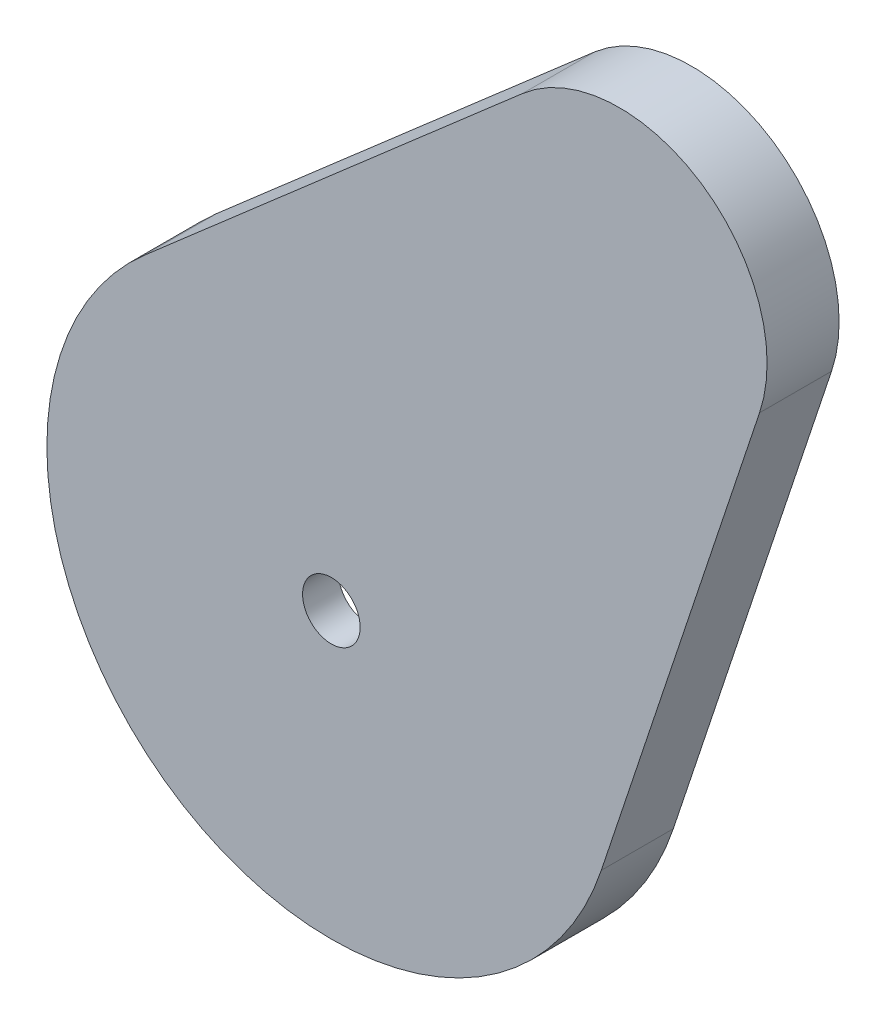
ISO-10303-21;
HEADER;
FILE_DESCRIPTION(('STEP AP214'),'2;1');
FILE_NAME('part.step','',(''),(''),'','','');
FILE_SCHEMA(('AUTOMOTIVE_DESIGN { 1 0 10303 214 1 1 1 1 }'));
ENDSEC;
DATA;
#1=APPLICATION_CONTEXT('core data for automotive mechanical design processes');
#2=APPLICATION_PROTOCOL_DEFINITION('international standard','automotive_design',2000,#1);
#3=PRODUCT_CONTEXT('',#1,'mechanical');
#4=PRODUCT('Part','Part','',(#3));
#5=PRODUCT_RELATED_PRODUCT_CATEGORY('part','',(#4));
#6=PRODUCT_DEFINITION_FORMATION('','',#4);
#7=PRODUCT_DEFINITION_CONTEXT('part definition',#1,'design');
#8=PRODUCT_DEFINITION('design','',#6,#7);
#9=PRODUCT_DEFINITION_SHAPE('','',#8);
#10=(LENGTH_UNIT() NAMED_UNIT(*) SI_UNIT(.MILLI.,.METRE.));
#11=(NAMED_UNIT(*) PLANE_ANGLE_UNIT() SI_UNIT($,.RADIAN.));
#12=(NAMED_UNIT(*) SI_UNIT($,.STERADIAN.) SOLID_ANGLE_UNIT());
#13=UNCERTAINTY_MEASURE_WITH_UNIT(LENGTH_MEASURE(1.E-05),#10,'distance_accuracy_value','');
#14=(GEOMETRIC_REPRESENTATION_CONTEXT(3) GLOBAL_UNCERTAINTY_ASSIGNED_CONTEXT((#13)) GLOBAL_UNIT_ASSIGNED_CONTEXT((#10,
#11,#12)) REPRESENTATION_CONTEXT('',''));
#15=CARTESIAN_POINT('',(0.,0.,0.));
#16=DIRECTION('',(0.,0.,1.));
#17=DIRECTION('',(1.,0.,0.));
#18=AXIS2_PLACEMENT_3D('',#15,#16,#17);
#19=CARTESIAN_POINT('',(30.0459923158457,38.3794117999098,0.));
#20=DIRECTION('',(0.,0.,1.));
#21=DIRECTION('',(1.,0.,0.));
#22=AXIS2_PLACEMENT_3D('',#19,#20,#21);
#23=PLANE('',#22);
#24=CARTESIAN_POINT('',(30.0459923158457,38.3794117999098,0.));
#25=DIRECTION('',(0.,0.,1.));
#26=DIRECTION('',(1.,0.,0.));
#27=AXIS2_PLACEMENT_3D('',#24,#25,#26);
#28=CIRCLE('',#27,20.5);
#29=CARTESIAN_POINT('',(49.4964525148463,31.9041050081744,0.));
#30=VERTEX_POINT('',#29);
#31=CARTESIAN_POINT('',(16.5878397994166,53.8431801260499,0.));
#32=VERTEX_POINT('',#31);
#33=EDGE_CURVE('E116',#30,#32,#28,.T.);
#34=ORIENTED_EDGE('',*,*,#33,.F.);
#35=DIRECTION('',(0.315868623987095,0.948802936536613,0.));
#36=VECTOR('',#35,1.);
#37=CARTESIAN_POINT('',(27.523708309041,-34.0973989179884,0.));
#38=LINE('',#37,#36);
#39=CARTESIAN_POINT('',(27.523708309041,-34.0973989179884,0.));
#40=VERTEX_POINT('',#39);
#41=EDGE_CURVE('E193',#40,#30,#38,.T.);
#42=ORIENTED_EDGE('',*,*,#41,.F.);
#43=CARTESIAN_POINT('',(-9.95400768415523,-21.6205882704981,0.));
#44=DIRECTION('',(0.,0.,1.));
#45=DIRECTION('',(1.,0.,0.));
#46=AXIS2_PLACEMENT_3D('',#43,#44,#45);
#47=CIRCLE('',#46,39.5);
#48=CARTESIAN_POINT('',(-35.8855698499576,8.17545313840598,0.));
#49=VERTEX_POINT('',#48);
#50=EDGE_CURVE('E190',#49,#40,#47,.T.);
#51=ORIENTED_EDGE('',*,*,#50,.F.);
#52=DIRECTION('',(-0.754330162250736,-0.656495244703858,0.));
#53=VECTOR('',#52,1.);
#54=CARTESIAN_POINT('',(16.5878397994166,53.8431801260499,0.));
#55=LINE('',#54,#53);
#56=EDGE_CURVE('E187',#32,#49,#55,.T.);
#57=ORIENTED_EDGE('',*,*,#56,.F.);
#58=EDGE_LOOP('',(#34,#42,#51,#57));
#59=FACE_BOUND('',#58,.T.);
#60=CARTESIAN_POINT('',(30.0459923158457,38.3794117999098,0.));
#61=DIRECTION('',(0.,0.,1.));
#62=DIRECTION('',(1.,0.,0.));
#63=AXIS2_PLACEMENT_3D('',#60,#61,#62);
#64=CIRCLE('',#63,10.5);
#65=CARTESIAN_POINT('',(40.0084231494801,35.0627912480453,0.));
#66=VERTEX_POINT('',#65);
#67=CARTESIAN_POINT('',(23.1527922464552,46.2998785035426,0.));
#68=VERTEX_POINT('',#67);
#69=EDGE_CURVE('E67',#66,#68,#64,.T.);
#70=ORIENTED_EDGE('',*,*,#69,.T.);
#71=DIRECTION('',(-0.754330162250736,-0.656495244703858,0.));
#72=VECTOR('',#71,1.);
#73=CARTESIAN_POINT('',(23.1527922464552,46.2998785035426,0.));
#74=LINE('',#73,#72);
#75=CARTESIAN_POINT('',(-29.320617402919,0.63215151589863,0.));
#76=VERTEX_POINT('',#75);
#77=EDGE_CURVE('E163',#68,#76,#74,.T.);
#78=ORIENTED_EDGE('',*,*,#77,.T.);
#79=CARTESIAN_POINT('',(-9.95400768415523,-21.6205882704981,0.));
#80=DIRECTION('',(0.,0.,1.));
#81=DIRECTION('',(1.,0.,0.));
#82=AXIS2_PLACEMENT_3D('',#79,#80,#81);
#83=CIRCLE('',#82,29.5);
#84=CARTESIAN_POINT('',(18.0356789436748,-30.9387126781174,0.));
#85=VERTEX_POINT('',#84);
#86=EDGE_CURVE('E167',#76,#85,#83,.T.);
#87=ORIENTED_EDGE('',*,*,#86,.T.);
#88=DIRECTION('',(0.315868623987095,0.948802936536612,0.));
#89=VECTOR('',#88,1.);
#90=CARTESIAN_POINT('',(18.0356789436748,-30.9387126781174,0.));
#91=LINE('',#90,#89);
#92=EDGE_CURVE('E150',#85,#66,#91,.T.);
#93=ORIENTED_EDGE('',*,*,#92,.T.);
#94=EDGE_LOOP('',(#70,#78,#87,#93));
#95=FACE_BOUND('',#94,.T.);
#96=ADVANCED_FACE('F43',(#59,#95),#23,.F.);
#97=CARTESIAN_POINT('',(30.0459923158457,38.3794117999098,5.));
#98=DIRECTION('',(0.,0.,-1.));
#99=DIRECTION('',(-1.,0.,0.));
#100=AXIS2_PLACEMENT_3D('',#97,#98,#99);
#101=CYLINDRICAL_SURFACE('',#100,20.5);
#102=ORIENTED_EDGE('',*,*,#33,.T.);
#103=DIRECTION('',(0.,0.,-1.));
#104=VECTOR('',#103,1.);
#105=CARTESIAN_POINT('',(16.5878397994166,53.8431801260499,5.));
#106=LINE('',#105,#104);
#107=CARTESIAN_POINT('',(16.5878397994166,53.8431801260499,10.));
#108=VERTEX_POINT('',#107);
#109=EDGE_CURVE('E11',#108,#32,#106,.T.);
#110=ORIENTED_EDGE('',*,*,#109,.F.);
#111=CARTESIAN_POINT('',(30.0459923158457,38.3794117999098,10.));
#112=DIRECTION('',(0.,0.,1.));
#113=DIRECTION('',(1.,0.,0.));
#114=AXIS2_PLACEMENT_3D('',#111,#112,#113);
#115=CIRCLE('',#114,20.5);
#116=CARTESIAN_POINT('',(49.4964525148462,31.9041050081744,10.));
#117=VERTEX_POINT('',#116);
#118=EDGE_CURVE('E114',#117,#108,#115,.T.);
#119=ORIENTED_EDGE('',*,*,#118,.F.);
#120=DIRECTION('',(0.,0.,-1.));
#121=VECTOR('',#120,1.);
#122=CARTESIAN_POINT('',(49.4964525148463,31.9041050081744,5.));
#123=LINE('',#122,#121);
#124=EDGE_CURVE('E196',#117,#30,#123,.T.);
#125=ORIENTED_EDGE('',*,*,#124,.T.);
#126=EDGE_LOOP('',(#102,#110,#119,#125));
#127=FACE_BOUND('',#126,.T.);
#128=ADVANCED_FACE('F45',(#127),#101,.T.);
#129=CARTESIAN_POINT('',(16.5878397994166,53.8431801260499,5.));
#130=DIRECTION('',(0.656495244703858,-0.754330162250736,0.));
#131=DIRECTION('',(0.754330162250736,0.656495244703858,0.));
#132=AXIS2_PLACEMENT_3D('',#129,#130,#131);
#133=PLANE('',#132);
#134=ORIENTED_EDGE('',*,*,#56,.T.);
#135=DIRECTION('',(0.,0.,-1.));
#136=VECTOR('',#135,1.);
#137=CARTESIAN_POINT('',(-35.8855698499576,8.17545313840598,5.));
#138=LINE('',#137,#136);
#139=CARTESIAN_POINT('',(-35.8855698499577,8.17545313840598,10.));
#140=VERTEX_POINT('',#139);
#141=EDGE_CURVE('E52',#140,#49,#138,.T.);
#142=ORIENTED_EDGE('',*,*,#141,.F.);
#143=DIRECTION('',(-0.754330162250736,-0.656495244703858,0.));
#144=VECTOR('',#143,1.);
#145=CARTESIAN_POINT('',(16.5878397994166,53.8431801260499,10.));
#146=LINE('',#145,#144);
#147=EDGE_CURVE('E119',#108,#140,#146,.T.);
#148=ORIENTED_EDGE('',*,*,#147,.F.);
#149=ORIENTED_EDGE('',*,*,#109,.T.);
#150=EDGE_LOOP('',(#134,#142,#148,#149));
#151=FACE_BOUND('',#150,.T.);
#152=ADVANCED_FACE('F120',(#151),#133,.F.);
#153=CARTESIAN_POINT('',(-9.95400768415523,-21.6205882704981,5.));
#154=DIRECTION('',(0.,0.,-1.));
#155=DIRECTION('',(-1.,0.,0.));
#156=AXIS2_PLACEMENT_3D('',#153,#154,#155);
#157=CYLINDRICAL_SURFACE('',#156,39.5);
#158=ORIENTED_EDGE('',*,*,#50,.T.);
#159=DIRECTION('',(0.,0.,-1.));
#160=VECTOR('',#159,1.);
#161=CARTESIAN_POINT('',(27.523708309041,-34.0973989179884,5.));
#162=LINE('',#161,#160);
#163=CARTESIAN_POINT('',(27.523708309041,-34.0973989179884,10.));
#164=VERTEX_POINT('',#163);
#165=EDGE_CURVE('E199',#164,#40,#162,.T.);
#166=ORIENTED_EDGE('',*,*,#165,.F.);
#167=CARTESIAN_POINT('',(-9.95400768415523,-21.6205882704981,10.));
#168=DIRECTION('',(0.,0.,1.));
#169=DIRECTION('',(1.,0.,0.));
#170=AXIS2_PLACEMENT_3D('',#167,#168,#169);
#171=CIRCLE('',#170,39.5);
#172=EDGE_CURVE('E126',#140,#164,#171,.T.);
#173=ORIENTED_EDGE('',*,*,#172,.F.);
#174=ORIENTED_EDGE('',*,*,#141,.T.);
#175=EDGE_LOOP('',(#158,#166,#173,#174));
#176=FACE_BOUND('',#175,.T.);
#177=ADVANCED_FACE('F205',(#176),#157,.T.);
#178=CARTESIAN_POINT('',(27.523708309041,-34.0973989179884,5.));
#179=DIRECTION('',(-0.948802936536613,0.315868623987095,0.));
#180=DIRECTION('',(-0.315868623987095,-0.948802936536613,0.));
#181=AXIS2_PLACEMENT_3D('',#178,#179,#180);
#182=PLANE('',#181);
#183=ORIENTED_EDGE('',*,*,#41,.T.);
#184=ORIENTED_EDGE('',*,*,#124,.F.);
#185=DIRECTION('',(0.315868623987095,0.948802936536612,0.));
#186=VECTOR('',#185,1.);
#187=CARTESIAN_POINT('',(27.523708309041,-34.0973989179884,10.));
#188=LINE('',#187,#186);
#189=EDGE_CURVE('E131',#164,#117,#188,.T.);
#190=ORIENTED_EDGE('',*,*,#189,.F.);
#191=ORIENTED_EDGE('',*,*,#165,.T.);
#192=EDGE_LOOP('',(#183,#184,#190,#191));
#193=FACE_BOUND('',#192,.T.);
#194=ADVANCED_FACE('F210',(#193),#182,.F.);
#195=CARTESIAN_POINT('',(30.0459923158457,38.3794117999098,5.));
#196=DIRECTION('',(0.,0.,-1.));
#197=DIRECTION('',(-1.,0.,0.));
#198=AXIS2_PLACEMENT_3D('',#195,#196,#197);
#199=CYLINDRICAL_SURFACE('',#198,10.5);
#200=ORIENTED_EDGE('',*,*,#69,.F.);
#201=DIRECTION('',(0.,0.,-1.));
#202=VECTOR('',#201,1.);
#203=CARTESIAN_POINT('',(40.0084231494801,35.0627912480453,5.));
#204=LINE('',#203,#202);
#205=CARTESIAN_POINT('',(40.0084231494801,35.0627912480453,5.));
#206=VERTEX_POINT('',#205);
#207=EDGE_CURVE('E160',#206,#66,#204,.T.);
#208=ORIENTED_EDGE('',*,*,#207,.F.);
#209=CARTESIAN_POINT('',(30.0459923158457,38.3794117999098,5.));
#210=DIRECTION('',(0.,0.,1.));
#211=DIRECTION('',(1.,0.,0.));
#212=AXIS2_PLACEMENT_3D('',#209,#210,#211);
#213=CIRCLE('',#212,10.5);
#214=CARTESIAN_POINT('',(23.1527922464552,46.2998785035426,5.));
#215=VERTEX_POINT('',#214);
#216=EDGE_CURVE('E145',#206,#215,#213,.T.);
#217=ORIENTED_EDGE('',*,*,#216,.T.);
#218=DIRECTION('',(0.,0.,-1.));
#219=VECTOR('',#218,1.);
#220=CARTESIAN_POINT('',(23.1527922464552,46.2998785035426,5.));
#221=LINE('',#220,#219);
#222=EDGE_CURVE('E182',#215,#68,#221,.T.);
#223=ORIENTED_EDGE('',*,*,#222,.T.);
#224=EDGE_LOOP('',(#200,#208,#217,#223));
#225=FACE_BOUND('',#224,.T.);
#226=ADVANCED_FACE('F212',(#225),#199,.F.);
#227=CARTESIAN_POINT('',(23.1527922464552,46.2998785035426,5.));
#228=DIRECTION('',(0.656495244703858,-0.754330162250736,0.));
#229=DIRECTION('',(0.754330162250736,0.656495244703858,0.));
#230=AXIS2_PLACEMENT_3D('',#227,#228,#229);
#231=PLANE('',#230);
#232=ORIENTED_EDGE('',*,*,#77,.F.);
#233=ORIENTED_EDGE('',*,*,#222,.F.);
#234=DIRECTION('',(-0.754330162250736,-0.656495244703858,0.));
#235=VECTOR('',#234,1.);
#236=CARTESIAN_POINT('',(23.1527922464552,46.2998785035426,5.));
#237=LINE('',#236,#235);
#238=CARTESIAN_POINT('',(-29.320617402919,0.63215151589863,5.));
#239=VERTEX_POINT('',#238);
#240=EDGE_CURVE('E149',#215,#239,#237,.T.);
#241=ORIENTED_EDGE('',*,*,#240,.T.);
#242=DIRECTION('',(0.,0.,-1.));
#243=VECTOR('',#242,1.);
#244=CARTESIAN_POINT('',(-29.320617402919,0.63215151589863,5.));
#245=LINE('',#244,#243);
#246=EDGE_CURVE('E179',#239,#76,#245,.T.);
#247=ORIENTED_EDGE('',*,*,#246,.T.);
#248=EDGE_LOOP('',(#232,#233,#241,#247));
#249=FACE_BOUND('',#248,.T.);
#250=ADVANCED_FACE('F218',(#249),#231,.T.);
#251=CARTESIAN_POINT('',(-9.95400768415523,-21.6205882704981,5.));
#252=DIRECTION('',(0.,0.,-1.));
#253=DIRECTION('',(-1.,0.,0.));
#254=AXIS2_PLACEMENT_3D('',#251,#252,#253);
#255=CYLINDRICAL_SURFACE('',#254,29.5);
#256=ORIENTED_EDGE('',*,*,#86,.F.);
#257=ORIENTED_EDGE('',*,*,#246,.F.);
#258=CARTESIAN_POINT('',(-9.95400768415523,-21.6205882704981,5.));
#259=DIRECTION('',(0.,0.,1.));
#260=DIRECTION('',(1.,0.,0.));
#261=AXIS2_PLACEMENT_3D('',#258,#259,#260);
#262=CIRCLE('',#261,29.5);
#263=CARTESIAN_POINT('',(18.0356789436748,-30.9387126781174,5.));
#264=VERTEX_POINT('',#263);
#265=EDGE_CURVE('E154',#239,#264,#262,.T.);
#266=ORIENTED_EDGE('',*,*,#265,.T.);
#267=DIRECTION('',(0.,0.,-1.));
#268=VECTOR('',#267,1.);
#269=CARTESIAN_POINT('',(18.0356789436748,-30.9387126781174,5.));
#270=LINE('',#269,#268);
#271=EDGE_CURVE('E176',#264,#85,#270,.T.);
#272=ORIENTED_EDGE('',*,*,#271,.T.);
#273=EDGE_LOOP('',(#256,#257,#266,#272));
#274=FACE_BOUND('',#273,.T.);
#275=ADVANCED_FACE('F229',(#274),#255,.F.);
#276=CARTESIAN_POINT('',(18.0356789436748,-30.9387126781174,5.));
#277=DIRECTION('',(-0.948802936536613,0.315868623987095,0.));
#278=DIRECTION('',(-0.315868623987095,-0.948802936536613,0.));
#279=AXIS2_PLACEMENT_3D('',#276,#277,#278);
#280=PLANE('',#279);
#281=ORIENTED_EDGE('',*,*,#92,.F.);
#282=ORIENTED_EDGE('',*,*,#271,.F.);
#283=DIRECTION('',(0.315868623987095,0.948802936536612,0.));
#284=VECTOR('',#283,1.);
#285=CARTESIAN_POINT('',(18.0356789436748,-30.9387126781174,5.));
#286=LINE('',#285,#284);
#287=EDGE_CURVE('E59',#264,#206,#286,.T.);
#288=ORIENTED_EDGE('',*,*,#287,.T.);
#289=ORIENTED_EDGE('',*,*,#207,.T.);
#290=EDGE_LOOP('',(#281,#282,#288,#289));
#291=FACE_BOUND('',#290,.T.);
#292=ADVANCED_FACE('F233',(#291),#280,.T.);
#293=CARTESIAN_POINT('',(30.0459923158457,38.3794117999098,5.));
#294=DIRECTION('',(0.,0.,1.));
#295=DIRECTION('',(1.,0.,0.));
#296=AXIS2_PLACEMENT_3D('',#293,#294,#295);
#297=PLANE('',#296);
#298=CARTESIAN_POINT('',(-9.95400768415523,-21.6205882704981,5.));
#299=DIRECTION('',(0.,0.,1.));
#300=DIRECTION('',(1.,0.,0.));
#301=AXIS2_PLACEMENT_3D('',#298,#299,#300);
#302=CIRCLE('',#301,4.);
#303=CARTESIAN_POINT('',(-5.95400768415523,-21.6205882704981,5.));
#304=VERTEX_POINT('',#303);
#305=EDGE_CURVE('E133',#304,#304,#302,.T.);
#306=ORIENTED_EDGE('',*,*,#305,.T.);
#307=EDGE_LOOP('',(#306));
#308=FACE_BOUND('',#307,.T.);
#309=ORIENTED_EDGE('',*,*,#240,.F.);
#310=ORIENTED_EDGE('',*,*,#216,.F.);
#311=ORIENTED_EDGE('',*,*,#287,.F.);
#312=ORIENTED_EDGE('',*,*,#265,.F.);
#313=EDGE_LOOP('',(#309,#310,#311,#312));
#314=FACE_BOUND('',#313,.T.);
#315=ADVANCED_FACE('F237',(#308,#314),#297,.F.);
#316=CARTESIAN_POINT('',(30.0459923158457,38.3794117999098,10.));
#317=DIRECTION('',(0.,0.,1.));
#318=DIRECTION('',(1.,0.,0.));
#319=AXIS2_PLACEMENT_3D('',#316,#317,#318);
#320=PLANE('',#319);
#321=CARTESIAN_POINT('',(-9.95400768415523,-21.6205882704981,10.));
#322=DIRECTION('',(0.,0.,1.));
#323=DIRECTION('',(1.,0.,0.));
#324=AXIS2_PLACEMENT_3D('',#321,#322,#323);
#325=CIRCLE('',#324,4.);
#326=CARTESIAN_POINT('',(-5.95400768415523,-21.6205882704981,10.));
#327=VERTEX_POINT('',#326);
#328=EDGE_CURVE('E137',#327,#327,#325,.T.);
#329=ORIENTED_EDGE('',*,*,#328,.F.);
#330=EDGE_LOOP('',(#329));
#331=FACE_BOUND('',#330,.T.);
#332=ORIENTED_EDGE('',*,*,#118,.T.);
#333=ORIENTED_EDGE('',*,*,#147,.T.);
#334=ORIENTED_EDGE('',*,*,#172,.T.);
#335=ORIENTED_EDGE('',*,*,#189,.T.);
#336=EDGE_LOOP('',(#332,#333,#334,#335));
#337=FACE_BOUND('',#336,.T.);
#338=ADVANCED_FACE('F129',(#331,#337),#320,.T.);
#339=CARTESIAN_POINT('',(-9.95400768415523,-21.6205882704981,5.));
#340=DIRECTION('',(0.,0.,1.));
#341=DIRECTION('',(1.,0.,0.));
#342=AXIS2_PLACEMENT_3D('',#339,#340,#341);
#343=CYLINDRICAL_SURFACE('',#342,4.);
#344=ORIENTED_EDGE('',*,*,#305,.F.);
#345=EDGE_LOOP('',(#344));
#346=FACE_BOUND('',#345,.T.);
#347=ORIENTED_EDGE('',*,*,#328,.T.);
#348=EDGE_LOOP('',(#347));
#349=FACE_BOUND('',#348,.T.);
#350=ADVANCED_FACE('F244',(#346,#349),#343,.F.);
#351=CLOSED_SHELL('',(#96,#128,#152,#177,#194,#226,#250,#275,#292,#315,#338,#350));
#352=MANIFOLD_SOLID_BREP('B2',#351);
#353=ADVANCED_BREP_SHAPE_REPRESENTATION('',(#18,#352),#14);
#354=SHAPE_DEFINITION_REPRESENTATION(#9,#353);
ENDSEC;
END-ISO-10303-21;
